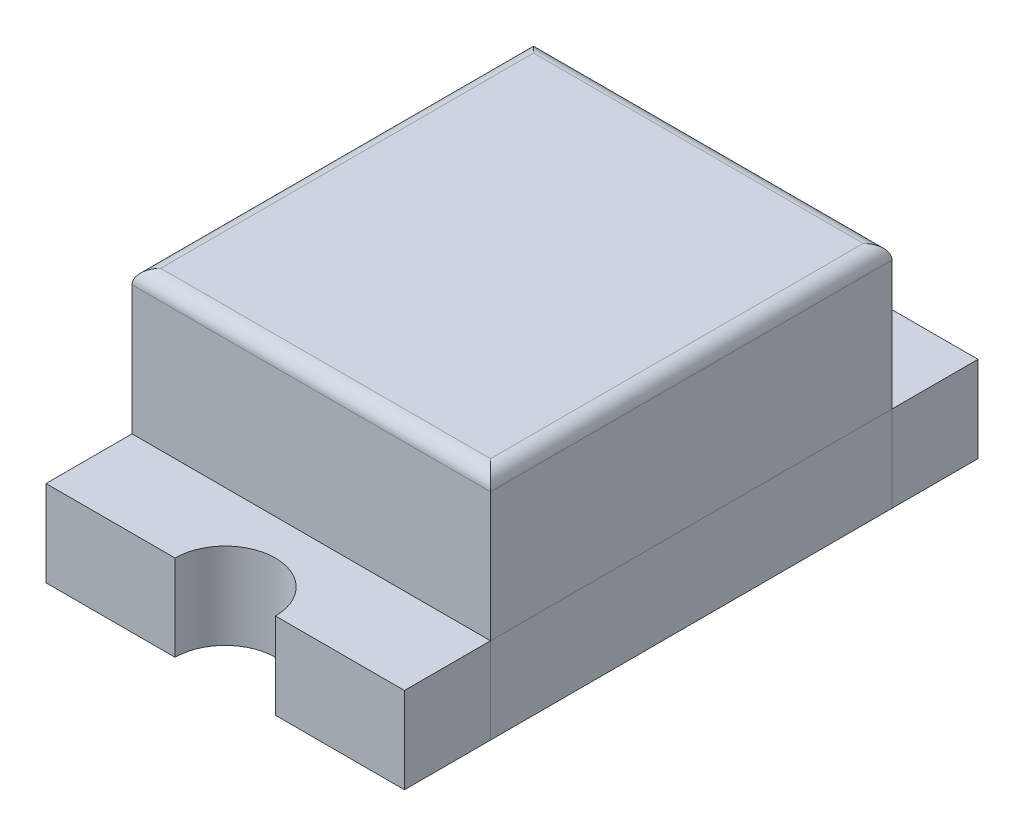
ISO-10303-21;
HEADER;
FILE_DESCRIPTION(('STEP AP214'),'2;1');
FILE_NAME('part.step','',(''),(''),'','','');
FILE_SCHEMA(('AUTOMOTIVE_DESIGN { 1 0 10303 214 1 1 1 1 }'));
ENDSEC;
DATA;
#1=APPLICATION_CONTEXT('core data for automotive mechanical design processes');
#2=APPLICATION_PROTOCOL_DEFINITION('international standard','automotive_design',2000,#1);
#3=PRODUCT_CONTEXT('',#1,'mechanical');
#4=PRODUCT('Part','Part','',(#3));
#5=PRODUCT_RELATED_PRODUCT_CATEGORY('part','',(#4));
#6=PRODUCT_DEFINITION_FORMATION('','',#4);
#7=PRODUCT_DEFINITION_CONTEXT('part definition',#1,'design');
#8=PRODUCT_DEFINITION('design','',#6,#7);
#9=PRODUCT_DEFINITION_SHAPE('','',#8);
#10=(LENGTH_UNIT() NAMED_UNIT(*) SI_UNIT(.MILLI.,.METRE.));
#11=(NAMED_UNIT(*) PLANE_ANGLE_UNIT() SI_UNIT($,.RADIAN.));
#12=(NAMED_UNIT(*) SI_UNIT($,.STERADIAN.) SOLID_ANGLE_UNIT());
#13=UNCERTAINTY_MEASURE_WITH_UNIT(LENGTH_MEASURE(1.E-05),#10,'distance_accuracy_value','');
#14=(GEOMETRIC_REPRESENTATION_CONTEXT(3) GLOBAL_UNCERTAINTY_ASSIGNED_CONTEXT((#13)) GLOBAL_UNIT_ASSIGNED_CONTEXT((#10,
#11,#12)) REPRESENTATION_CONTEXT('',''));
#15=CARTESIAN_POINT('',(0.,0.,0.));
#16=DIRECTION('',(0.,0.,1.));
#17=DIRECTION('',(1.,0.,0.));
#18=AXIS2_PLACEMENT_3D('',#15,#16,#17);
#19=CARTESIAN_POINT('',(0.1,0.35,0.2));
#20=DIRECTION('',(-1.,0.,0.));
#21=DIRECTION('',(0.,0.,1.));
#22=AXIS2_PLACEMENT_3D('',#19,#20,#21);
#23=PLANE('',#22);
#24=DIRECTION('',(0.,0.,-1.));
#25=VECTOR('',#24,1.);
#26=CARTESIAN_POINT('',(0.1,0.3,0.2));
#27=LINE('',#26,#25);
#28=CARTESIAN_POINT('',(0.1,0.3,0.2));
#29=VERTEX_POINT('',#28);
#30=CARTESIAN_POINT('',(0.1,0.3,0.));
#31=VERTEX_POINT('',#30);
#32=EDGE_CURVE('E115',#29,#31,#27,.T.);
#33=ORIENTED_EDGE('',*,*,#32,.T.);
#34=DIRECTION('',(0.,-1.,0.));
#35=VECTOR('',#34,1.);
#36=CARTESIAN_POINT('',(0.1,0.35,0.));
#37=LINE('',#36,#35);
#38=CARTESIAN_POINT('',(0.1,0.35,0.));
#39=VERTEX_POINT('',#38);
#40=EDGE_CURVE('E12',#39,#31,#37,.T.);
#41=ORIENTED_EDGE('',*,*,#40,.F.);
#42=DIRECTION('',(0.,0.,-1.));
#43=VECTOR('',#42,1.);
#44=CARTESIAN_POINT('',(0.1,0.35,0.2));
#45=LINE('',#44,#43);
#46=CARTESIAN_POINT('',(0.1,0.35,0.2));
#47=VERTEX_POINT('',#46);
#48=EDGE_CURVE('E103',#47,#39,#45,.T.);
#49=ORIENTED_EDGE('',*,*,#48,.F.);
#50=DIRECTION('',(0.,-1.,0.));
#51=VECTOR('',#50,1.);
#52=CARTESIAN_POINT('',(0.1,0.35,0.2));
#53=LINE('',#52,#51);
#54=EDGE_CURVE('E111',#47,#29,#53,.T.);
#55=ORIENTED_EDGE('',*,*,#54,.T.);
#56=EDGE_LOOP('',(#33,#41,#49,#55));
#57=FACE_BOUND('',#56,.T.);
#58=ADVANCED_FACE('F52',(#57),#23,.F.);
#59=CARTESIAN_POINT('',(-0.1,0.35,0.));
#60=DIRECTION('',(0.,0.,1.));
#61=DIRECTION('',(1.,0.,0.));
#62=AXIS2_PLACEMENT_3D('',#59,#60,#61);
#63=PLANE('',#62);
#64=DIRECTION('',(-1.,0.,0.));
#65=VECTOR('',#64,1.);
#66=CARTESIAN_POINT('',(-0.1,0.3,0.));
#67=LINE('',#66,#65);
#68=CARTESIAN_POINT('',(-0.1,0.3,0.));
#69=VERTEX_POINT('',#68);
#70=EDGE_CURVE('E107',#31,#69,#67,.T.);
#71=ORIENTED_EDGE('',*,*,#70,.T.);
#72=DIRECTION('',(0.,-1.,0.));
#73=VECTOR('',#72,1.);
#74=CARTESIAN_POINT('',(-0.1,0.35,0.));
#75=LINE('',#74,#73);
#76=CARTESIAN_POINT('',(-0.1,0.35,0.));
#77=VERTEX_POINT('',#76);
#78=EDGE_CURVE('E60',#77,#69,#75,.T.);
#79=ORIENTED_EDGE('',*,*,#78,.F.);
#80=DIRECTION('',(-1.,0.,0.));
#81=VECTOR('',#80,1.);
#82=CARTESIAN_POINT('',(-0.1,0.35,0.));
#83=LINE('',#82,#81);
#84=EDGE_CURVE('E98',#39,#77,#83,.T.);
#85=ORIENTED_EDGE('',*,*,#84,.F.);
#86=ORIENTED_EDGE('',*,*,#40,.T.);
#87=EDGE_LOOP('',(#71,#79,#85,#86));
#88=FACE_BOUND('',#87,.T.);
#89=ADVANCED_FACE('F106',(#88),#63,.F.);
#90=CARTESIAN_POINT('',(-0.1,0.35,0.2));
#91=DIRECTION('',(1.,0.,0.));
#92=DIRECTION('',(0.,0.,-1.));
#93=AXIS2_PLACEMENT_3D('',#90,#91,#92);
#94=PLANE('',#93);
#95=DIRECTION('',(0.,0.,1.));
#96=VECTOR('',#95,1.);
#97=CARTESIAN_POINT('',(-0.1,0.3,0.2));
#98=LINE('',#97,#96);
#99=CARTESIAN_POINT('',(-0.1,0.3,0.2));
#100=VERTEX_POINT('',#99);
#101=EDGE_CURVE('E85',#69,#100,#98,.T.);
#102=ORIENTED_EDGE('',*,*,#101,.T.);
#103=DIRECTION('',(0.,-1.,0.));
#104=VECTOR('',#103,1.);
#105=CARTESIAN_POINT('',(-0.1,0.35,0.2));
#106=LINE('',#105,#104);
#107=CARTESIAN_POINT('',(-0.1,0.35,0.2));
#108=VERTEX_POINT('',#107);
#109=EDGE_CURVE('E108',#108,#100,#106,.T.);
#110=ORIENTED_EDGE('',*,*,#109,.F.);
#111=DIRECTION('',(0.,0.,1.));
#112=VECTOR('',#111,1.);
#113=CARTESIAN_POINT('',(-0.1,0.35,0.2));
#114=LINE('',#113,#112);
#115=EDGE_CURVE('E101',#77,#108,#114,.T.);
#116=ORIENTED_EDGE('',*,*,#115,.F.);
#117=ORIENTED_EDGE('',*,*,#78,.T.);
#118=EDGE_LOOP('',(#102,#110,#116,#117));
#119=FACE_BOUND('',#118,.T.);
#120=ADVANCED_FACE('F109',(#119),#94,.F.);
#121=CARTESIAN_POINT('',(-0.1,0.35,0.2));
#122=DIRECTION('',(0.,0.,-1.));
#123=DIRECTION('',(-1.,0.,0.));
#124=AXIS2_PLACEMENT_3D('',#121,#122,#123);
#125=PLANE('',#124);
#126=DIRECTION('',(1.,0.,0.));
#127=VECTOR('',#126,1.);
#128=CARTESIAN_POINT('',(-0.1,0.3,0.2));
#129=LINE('',#128,#127);
#130=EDGE_CURVE('E91',#100,#29,#129,.T.);
#131=ORIENTED_EDGE('',*,*,#130,.T.);
#132=ORIENTED_EDGE('',*,*,#54,.F.);
#133=DIRECTION('',(1.,0.,0.));
#134=VECTOR('',#133,1.);
#135=CARTESIAN_POINT('',(-0.1,0.35,0.2));
#136=LINE('',#135,#134);
#137=EDGE_CURVE('E68',#108,#47,#136,.T.);
#138=ORIENTED_EDGE('',*,*,#137,.F.);
#139=ORIENTED_EDGE('',*,*,#109,.T.);
#140=EDGE_LOOP('',(#131,#132,#138,#139));
#141=FACE_BOUND('',#140,.T.);
#142=ADVANCED_FACE('F122',(#141),#125,.F.);
#143=CARTESIAN_POINT('',(0.,0.35,0.));
#144=DIRECTION('',(0.,-1.,0.));
#145=DIRECTION('',(0.,0.,-1.));
#146=AXIS2_PLACEMENT_3D('',#143,#144,#145);
#147=PLANE('',#146);
#148=ORIENTED_EDGE('',*,*,#48,.T.);
#149=ORIENTED_EDGE('',*,*,#84,.T.);
#150=ORIENTED_EDGE('',*,*,#115,.T.);
#151=ORIENTED_EDGE('',*,*,#137,.T.);
#152=EDGE_LOOP('',(#148,#149,#150,#151));
#153=FACE_BOUND('',#152,.T.);
#154=ADVANCED_FACE('F99',(#153),#147,.F.);
#155=CARTESIAN_POINT('',(0.,0.3,0.));
#156=DIRECTION('',(0.,-1.,0.));
#157=DIRECTION('',(0.,0.,-1.));
#158=AXIS2_PLACEMENT_3D('',#155,#156,#157);
#159=PLANE('',#158);
#160=ORIENTED_EDGE('',*,*,#32,.F.);
#161=ORIENTED_EDGE('',*,*,#130,.F.);
#162=ORIENTED_EDGE('',*,*,#101,.F.);
#163=ORIENTED_EDGE('',*,*,#70,.F.);
#164=EDGE_LOOP('',(#160,#161,#162,#163));
#165=FACE_BOUND('',#164,.T.);
#166=ADVANCED_FACE('F125',(#165),#159,.T.);
#167=CLOSED_SHELL('',(#58,#89,#120,#142,#154,#166));
#168=MANIFOLD_SOLID_BREP('B2',#167);
#169=CARTESIAN_POINT('',(-0.625,0.8,0.7));
#170=DIRECTION('',(0.,0.,-1.));
#171=DIRECTION('',(-1.,0.,0.));
#172=AXIS2_PLACEMENT_3D('',#169,#170,#171);
#173=PLANE('',#172);
#174=DIRECTION('',(0.,-1.,0.));
#175=VECTOR('',#174,1.);
#176=CARTESIAN_POINT('',(0.625,0.8,0.7));
#177=LINE('',#176,#175);
#178=CARTESIAN_POINT('',(0.625,0.75,0.7));
#179=VERTEX_POINT('',#178);
#180=CARTESIAN_POINT('',(0.625,0.3,0.7));
#181=VERTEX_POINT('',#180);
#182=EDGE_CURVE('E238',#179,#181,#177,.T.);
#183=ORIENTED_EDGE('',*,*,#182,.F.);
#184=DIRECTION('',(1.,0.,0.));
#185=VECTOR('',#184,1.);
#186=CARTESIAN_POINT('',(-0.625,0.75,0.7));
#187=LINE('',#186,#185);
#188=CARTESIAN_POINT('',(-0.625,0.75,0.7));
#189=VERTEX_POINT('',#188);
#190=EDGE_CURVE('E50',#179,#189,#187,.F.);
#191=ORIENTED_EDGE('',*,*,#190,.T.);
#192=DIRECTION('',(0.,-1.,0.));
#193=VECTOR('',#192,1.);
#194=CARTESIAN_POINT('',(-0.625,0.8,0.7));
#195=LINE('',#194,#193);
#196=CARTESIAN_POINT('',(-0.625,0.3,0.7));
#197=VERTEX_POINT('',#196);
#198=EDGE_CURVE('E252',#189,#197,#195,.T.);
#199=ORIENTED_EDGE('',*,*,#198,.T.);
#200=DIRECTION('',(1.,0.,0.));
#201=VECTOR('',#200,1.);
#202=CARTESIAN_POINT('',(-0.625,0.3,0.7));
#203=LINE('',#202,#201);
#204=EDGE_CURVE('E250',#197,#181,#203,.T.);
#205=ORIENTED_EDGE('',*,*,#204,.T.);
#206=EDGE_LOOP('',(#183,#191,#199,#205));
#207=FACE_BOUND('',#206,.T.);
#208=ADVANCED_FACE('F186',(#207),#173,.F.);
#209=CARTESIAN_POINT('',(0.625,0.8,-0.7));
#210=DIRECTION('',(1.,0.,0.));
#211=DIRECTION('',(0.,0.,-1.));
#212=AXIS2_PLACEMENT_3D('',#209,#210,#211);
#213=PLANE('',#212);
#214=DIRECTION('',(0.,-1.,0.));
#215=VECTOR('',#214,1.);
#216=CARTESIAN_POINT('',(0.625,0.8,-0.7));
#217=LINE('',#216,#215);
#218=CARTESIAN_POINT('',(0.625,0.75,-0.7));
#219=VERTEX_POINT('',#218);
#220=CARTESIAN_POINT('',(0.625,0.3,-0.7));
#221=VERTEX_POINT('',#220);
#222=EDGE_CURVE('E247',#219,#221,#217,.T.);
#223=ORIENTED_EDGE('',*,*,#222,.F.);
#224=DIRECTION('',(0.,0.,1.));
#225=VECTOR('',#224,1.);
#226=CARTESIAN_POINT('',(0.625,0.75,0.7));
#227=LINE('',#226,#225);
#228=EDGE_CURVE('E195',#219,#179,#227,.T.);
#229=ORIENTED_EDGE('',*,*,#228,.T.);
#230=ORIENTED_EDGE('',*,*,#182,.T.);
#231=DIRECTION('',(0.,0.,1.));
#232=VECTOR('',#231,1.);
#233=CARTESIAN_POINT('',(0.625,0.3,-0.7));
#234=LINE('',#233,#232);
#235=EDGE_CURVE('E242',#221,#181,#234,.T.);
#236=ORIENTED_EDGE('',*,*,#235,.F.);
#237=EDGE_LOOP('',(#223,#229,#230,#236));
#238=FACE_BOUND('',#237,.T.);
#239=ADVANCED_FACE('F240',(#238),#213,.T.);
#240=CARTESIAN_POINT('',(-0.625,0.8,-0.7));
#241=DIRECTION('',(0.,0.,-1.));
#242=DIRECTION('',(-1.,0.,0.));
#243=AXIS2_PLACEMENT_3D('',#240,#241,#242);
#244=PLANE('',#243);
#245=DIRECTION('',(0.,-1.,0.));
#246=VECTOR('',#245,1.);
#247=CARTESIAN_POINT('',(-0.625,0.8,-0.7));
#248=LINE('',#247,#246);
#249=CARTESIAN_POINT('',(-0.625,0.75,-0.7));
#250=VERTEX_POINT('',#249);
#251=CARTESIAN_POINT('',(-0.625,0.3,-0.7));
#252=VERTEX_POINT('',#251);
#253=EDGE_CURVE('E266',#250,#252,#248,.T.);
#254=ORIENTED_EDGE('',*,*,#253,.F.);
#255=DIRECTION('',(1.,0.,0.));
#256=VECTOR('',#255,1.);
#257=CARTESIAN_POINT('',(0.625,0.75,-0.7));
#258=LINE('',#257,#256);
#259=EDGE_CURVE('E210',#250,#219,#258,.T.);
#260=ORIENTED_EDGE('',*,*,#259,.T.);
#261=ORIENTED_EDGE('',*,*,#222,.T.);
#262=DIRECTION('',(1.,0.,0.));
#263=VECTOR('',#262,1.);
#264=CARTESIAN_POINT('',(-0.625,0.3,-0.7));
#265=LINE('',#264,#263);
#266=EDGE_CURVE('E259',#252,#221,#265,.T.);
#267=ORIENTED_EDGE('',*,*,#266,.F.);
#268=EDGE_LOOP('',(#254,#260,#261,#267));
#269=FACE_BOUND('',#268,.T.);
#270=ADVANCED_FACE('F315',(#269),#244,.T.);
#271=CARTESIAN_POINT('',(-0.625,0.8,-0.7));
#272=DIRECTION('',(1.,0.,0.));
#273=DIRECTION('',(0.,0.,-1.));
#274=AXIS2_PLACEMENT_3D('',#271,#272,#273);
#275=PLANE('',#274);
#276=ORIENTED_EDGE('',*,*,#198,.F.);
#277=DIRECTION('',(0.,0.,1.));
#278=VECTOR('',#277,1.);
#279=CARTESIAN_POINT('',(-0.625,0.75,-0.7));
#280=LINE('',#279,#278);
#281=EDGE_CURVE('E277',#189,#250,#280,.F.);
#282=ORIENTED_EDGE('',*,*,#281,.T.);
#283=ORIENTED_EDGE('',*,*,#253,.T.);
#284=DIRECTION('',(0.,0.,1.));
#285=VECTOR('',#284,1.);
#286=CARTESIAN_POINT('',(-0.625,0.3,-0.7));
#287=LINE('',#286,#285);
#288=EDGE_CURVE('E261',#252,#197,#287,.T.);
#289=ORIENTED_EDGE('',*,*,#288,.T.);
#290=EDGE_LOOP('',(#276,#282,#283,#289));
#291=FACE_BOUND('',#290,.T.);
#292=ADVANCED_FACE('F302',(#291),#275,.F.);
#293=CARTESIAN_POINT('',(0.,0.8,0.));
#294=DIRECTION('',(0.,-1.,0.));
#295=DIRECTION('',(0.,0.,-1.));
#296=AXIS2_PLACEMENT_3D('',#293,#294,#295);
#297=PLANE('',#296);
#298=DIRECTION('',(1.,0.,0.));
#299=VECTOR('',#298,1.);
#300=CARTESIAN_POINT('',(-0.625,0.8,-0.65));
#301=LINE('',#300,#299);
#302=CARTESIAN_POINT('',(0.575,0.8,-0.65));
#303=VERTEX_POINT('',#302);
#304=CARTESIAN_POINT('',(-0.575,0.8,-0.65));
#305=VERTEX_POINT('',#304);
#306=EDGE_CURVE('E272',#303,#305,#301,.F.);
#307=ORIENTED_EDGE('',*,*,#306,.T.);
#308=DIRECTION('',(0.,0.,1.));
#309=VECTOR('',#308,1.);
#310=CARTESIAN_POINT('',(-0.575,0.8,0.));
#311=LINE('',#310,#309);
#312=CARTESIAN_POINT('',(-0.575,0.8,0.65));
#313=VERTEX_POINT('',#312);
#314=EDGE_CURVE('E274',#305,#313,#311,.T.);
#315=ORIENTED_EDGE('',*,*,#314,.T.);
#316=DIRECTION('',(1.,0.,0.));
#317=VECTOR('',#316,1.);
#318=CARTESIAN_POINT('',(0.,0.8,0.65));
#319=LINE('',#318,#317);
#320=CARTESIAN_POINT('',(0.575,0.8,0.65));
#321=VERTEX_POINT('',#320);
#322=EDGE_CURVE('E246',#313,#321,#319,.T.);
#323=ORIENTED_EDGE('',*,*,#322,.T.);
#324=DIRECTION('',(0.,0.,1.));
#325=VECTOR('',#324,1.);
#326=CARTESIAN_POINT('',(0.575,0.8,-0.7));
#327=LINE('',#326,#325);
#328=EDGE_CURVE('E270',#321,#303,#327,.F.);
#329=ORIENTED_EDGE('',*,*,#328,.T.);
#330=EDGE_LOOP('',(#307,#315,#323,#329));
#331=FACE_BOUND('',#330,.T.);
#332=ADVANCED_FACE('F307',(#331),#297,.F.);
#333=CARTESIAN_POINT('',(0.,0.3,0.));
#334=DIRECTION('',(0.,-1.,0.));
#335=DIRECTION('',(0.,0.,-1.));
#336=AXIS2_PLACEMENT_3D('',#333,#334,#335);
#337=PLANE('',#336);
#338=ORIENTED_EDGE('',*,*,#204,.F.);
#339=ORIENTED_EDGE('',*,*,#288,.F.);
#340=ORIENTED_EDGE('',*,*,#266,.T.);
#341=ORIENTED_EDGE('',*,*,#235,.T.);
#342=EDGE_LOOP('',(#338,#339,#340,#341));
#343=FACE_BOUND('',#342,.T.);
#344=ADVANCED_FACE('F257',(#343),#337,.T.);
#345=CARTESIAN_POINT('',(0.575,0.75,-0.7));
#346=DIRECTION('',(0.,0.,-1.));
#347=DIRECTION('',(-1.,0.,0.));
#348=AXIS2_PLACEMENT_3D('',#345,#346,#347);
#349=CYLINDRICAL_SURFACE('',#348,0.05);
#350=CARTESIAN_POINT('',(0.575,0.75,0.65));
#351=DIRECTION('',(0.707106781186547,0.,-0.707106781186547));
#352=DIRECTION('',(0.707106781186547,0.,0.707106781186547));
#353=AXIS2_PLACEMENT_3D('',#350,#351,#352);
#354=ELLIPSE('',#353,0.0707106781186548,0.05);
#355=EDGE_CURVE('E285',#179,#321,#354,.F.);
#356=ORIENTED_EDGE('',*,*,#355,.F.);
#357=ORIENTED_EDGE('',*,*,#228,.F.);
#358=CARTESIAN_POINT('',(0.575,0.75,-0.65));
#359=DIRECTION('',(-0.707106781186547,0.,-0.707106781186547));
#360=DIRECTION('',(0.707106781186547,0.,-0.707106781186547));
#361=AXIS2_PLACEMENT_3D('',#358,#359,#360);
#362=ELLIPSE('',#361,0.0707106781186548,0.05);
#363=EDGE_CURVE('E190',#303,#219,#362,.T.);
#364=ORIENTED_EDGE('',*,*,#363,.F.);
#365=ORIENTED_EDGE('',*,*,#328,.F.);
#366=EDGE_LOOP('',(#356,#357,#364,#365));
#367=FACE_BOUND('',#366,.T.);
#368=ADVANCED_FACE('F188',(#367),#349,.T.);
#369=CARTESIAN_POINT('',(-0.625,0.75,-0.65));
#370=DIRECTION('',(-1.,0.,0.));
#371=DIRECTION('',(0.,0.,1.));
#372=AXIS2_PLACEMENT_3D('',#369,#370,#371);
#373=CYLINDRICAL_SURFACE('',#372,0.05);
#374=ORIENTED_EDGE('',*,*,#363,.T.);
#375=ORIENTED_EDGE('',*,*,#259,.F.);
#376=CARTESIAN_POINT('',(-0.575,0.75,-0.65));
#377=DIRECTION('',(-0.707106781186547,0.,0.707106781186547));
#378=DIRECTION('',(-0.707106781186547,0.,-0.707106781186547));
#379=AXIS2_PLACEMENT_3D('',#376,#377,#378);
#380=ELLIPSE('',#379,0.0707106781186548,0.05);
#381=EDGE_CURVE('E284',#305,#250,#380,.T.);
#382=ORIENTED_EDGE('',*,*,#381,.F.);
#383=ORIENTED_EDGE('',*,*,#306,.F.);
#384=EDGE_LOOP('',(#374,#375,#382,#383));
#385=FACE_BOUND('',#384,.T.);
#386=ADVANCED_FACE('F294',(#385),#373,.T.);
#387=CARTESIAN_POINT('',(0.,0.75,0.65));
#388=DIRECTION('',(1.,0.,0.));
#389=DIRECTION('',(0.,0.,-1.));
#390=AXIS2_PLACEMENT_3D('',#387,#388,#389);
#391=CYLINDRICAL_SURFACE('',#390,0.05);
#392=ORIENTED_EDGE('',*,*,#355,.T.);
#393=ORIENTED_EDGE('',*,*,#322,.F.);
#394=CARTESIAN_POINT('',(-0.575,0.75,0.65));
#395=DIRECTION('',(0.707106781186547,0.,0.707106781186547));
#396=DIRECTION('',(0.707106781186547,0.,-0.707106781186547));
#397=AXIS2_PLACEMENT_3D('',#394,#395,#396);
#398=ELLIPSE('',#397,0.0707106781186548,0.05);
#399=EDGE_CURVE('E282',#189,#313,#398,.F.);
#400=ORIENTED_EDGE('',*,*,#399,.F.);
#401=ORIENTED_EDGE('',*,*,#190,.F.);
#402=EDGE_LOOP('',(#392,#393,#400,#401));
#403=FACE_BOUND('',#402,.T.);
#404=ADVANCED_FACE('F299',(#403),#391,.T.);
#405=CARTESIAN_POINT('',(-0.575,0.75,0.));
#406=DIRECTION('',(0.,0.,1.));
#407=DIRECTION('',(1.,0.,0.));
#408=AXIS2_PLACEMENT_3D('',#405,#406,#407);
#409=CYLINDRICAL_SURFACE('',#408,0.05);
#410=ORIENTED_EDGE('',*,*,#381,.T.);
#411=ORIENTED_EDGE('',*,*,#281,.F.);
#412=ORIENTED_EDGE('',*,*,#399,.T.);
#413=ORIENTED_EDGE('',*,*,#314,.F.);
#414=EDGE_LOOP('',(#410,#411,#412,#413));
#415=FACE_BOUND('',#414,.T.);
#416=ADVANCED_FACE('F304',(#415),#409,.T.);
#417=CLOSED_SHELL('',(#208,#239,#270,#292,#332,#344,#368,#386,#404,#416));
#418=MANIFOLD_SOLID_BREP('B6',#417);
#419=CARTESIAN_POINT('',(-0.625,0.3,0.));
#420=DIRECTION('',(1.,0.,0.));
#421=DIRECTION('',(0.,0.,-1.));
#422=AXIS2_PLACEMENT_3D('',#419,#420,#421);
#423=PLANE('',#422);
#424=DIRECTION('',(0.,0.,1.));
#425=VECTOR('',#424,1.);
#426=CARTESIAN_POINT('',(-0.625,0.,0.));
#427=LINE('',#426,#425);
#428=CARTESIAN_POINT('',(-0.625,0.,-0.7));
#429=VERTEX_POINT('',#428);
#430=CARTESIAN_POINT('',(-0.625,0.,0.7));
#431=VERTEX_POINT('',#430);
#432=EDGE_CURVE('E463',#429,#431,#427,.T.);
#433=ORIENTED_EDGE('',*,*,#432,.T.);
#434=DIRECTION('',(0.,-1.,0.));
#435=VECTOR('',#434,1.);
#436=CARTESIAN_POINT('',(-0.625,0.3,0.7));
#437=LINE('',#436,#435);
#438=CARTESIAN_POINT('',(-0.625,0.3,0.7));
#439=VERTEX_POINT('',#438);
#440=EDGE_CURVE('E184',#439,#431,#437,.T.);
#441=ORIENTED_EDGE('',*,*,#440,.F.);
#442=DIRECTION('',(0.,0.,1.));
#443=VECTOR('',#442,1.);
#444=CARTESIAN_POINT('',(-0.625,0.3,0.));
#445=LINE('',#444,#443);
#446=CARTESIAN_POINT('',(-0.625,0.3,-0.7));
#447=VERTEX_POINT('',#446);
#448=EDGE_CURVE('E449',#447,#439,#445,.T.);
#449=ORIENTED_EDGE('',*,*,#448,.F.);
#450=DIRECTION('',(0.,-1.,0.));
#451=VECTOR('',#450,1.);
#452=CARTESIAN_POINT('',(-0.625,0.3,-0.7));
#453=LINE('',#452,#451);
#454=EDGE_CURVE('E416',#447,#429,#453,.T.);
#455=ORIENTED_EDGE('',*,*,#454,.T.);
#456=EDGE_LOOP('',(#433,#441,#449,#455));
#457=FACE_BOUND('',#456,.T.);
#458=ADVANCED_FACE('F400',(#457),#423,.F.);
#459=CARTESIAN_POINT('',(0.,0.3,0.7));
#460=DIRECTION('',(0.,0.,-1.));
#461=DIRECTION('',(-1.,0.,0.));
#462=AXIS2_PLACEMENT_3D('',#459,#460,#461);
#463=PLANE('',#462);
#464=DIRECTION('',(1.,0.,0.));
#465=VECTOR('',#464,1.);
#466=CARTESIAN_POINT('',(0.,0.,0.7));
#467=LINE('',#466,#465);
#468=CARTESIAN_POINT('',(0.625,0.,0.7));
#469=VERTEX_POINT('',#468);
#470=EDGE_CURVE('E454',#431,#469,#467,.T.);
#471=ORIENTED_EDGE('',*,*,#470,.T.);
#472=DIRECTION('',(0.,-1.,0.));
#473=VECTOR('',#472,1.);
#474=CARTESIAN_POINT('',(0.625,0.3,0.7));
#475=LINE('',#474,#473);
#476=CARTESIAN_POINT('',(0.625,0.3,0.7));
#477=VERTEX_POINT('',#476);
#478=EDGE_CURVE('E408',#477,#469,#475,.T.);
#479=ORIENTED_EDGE('',*,*,#478,.F.);
#480=DIRECTION('',(1.,0.,0.));
#481=VECTOR('',#480,1.);
#482=CARTESIAN_POINT('',(0.,0.3,0.7));
#483=LINE('',#482,#481);
#484=EDGE_CURVE('E441',#439,#477,#483,.T.);
#485=ORIENTED_EDGE('',*,*,#484,.F.);
#486=ORIENTED_EDGE('',*,*,#440,.T.);
#487=EDGE_LOOP('',(#471,#479,#485,#486));
#488=FACE_BOUND('',#487,.T.);
#489=ADVANCED_FACE('F453',(#488),#463,.F.);
#490=CARTESIAN_POINT('',(0.625,0.3,0.));
#491=DIRECTION('',(1.,0.,0.));
#492=DIRECTION('',(0.,0.,-1.));
#493=AXIS2_PLACEMENT_3D('',#490,#491,#492);
#494=PLANE('',#493);
#495=DIRECTION('',(0.,0.,1.));
#496=VECTOR('',#495,1.);
#497=CARTESIAN_POINT('',(0.625,0.,0.));
#498=LINE('',#497,#496);
#499=CARTESIAN_POINT('',(0.625,0.,-0.7));
#500=VERTEX_POINT('',#499);
#501=EDGE_CURVE('E466',#500,#469,#498,.T.);
#502=ORIENTED_EDGE('',*,*,#501,.F.);
#503=DIRECTION('',(0.,-1.,0.));
#504=VECTOR('',#503,1.);
#505=CARTESIAN_POINT('',(0.625,0.3,-0.7));
#506=LINE('',#505,#504);
#507=CARTESIAN_POINT('',(0.625,0.3,-0.7));
#508=VERTEX_POINT('',#507);
#509=EDGE_CURVE('E430',#508,#500,#506,.T.);
#510=ORIENTED_EDGE('',*,*,#509,.F.);
#511=DIRECTION('',(0.,0.,1.));
#512=VECTOR('',#511,1.);
#513=CARTESIAN_POINT('',(0.625,0.3,0.));
#514=LINE('',#513,#512);
#515=EDGE_CURVE('E448',#508,#477,#514,.T.);
#516=ORIENTED_EDGE('',*,*,#515,.T.);
#517=ORIENTED_EDGE('',*,*,#478,.T.);
#518=EDGE_LOOP('',(#502,#510,#516,#517));
#519=FACE_BOUND('',#518,.T.);
#520=ADVANCED_FACE('F457',(#519),#494,.T.);
#521=CARTESIAN_POINT('',(0.,0.3,-0.7));
#522=DIRECTION('',(0.,0.,-1.));
#523=DIRECTION('',(-1.,0.,0.));
#524=AXIS2_PLACEMENT_3D('',#521,#522,#523);
#525=PLANE('',#524);
#526=DIRECTION('',(1.,0.,0.));
#527=VECTOR('',#526,1.);
#528=CARTESIAN_POINT('',(0.,0.,-0.7));
#529=LINE('',#528,#527);
#530=EDGE_CURVE('E468',#429,#500,#529,.T.);
#531=ORIENTED_EDGE('',*,*,#530,.F.);
#532=ORIENTED_EDGE('',*,*,#454,.F.);
#533=DIRECTION('',(1.,0.,0.));
#534=VECTOR('',#533,1.);
#535=CARTESIAN_POINT('',(0.,0.3,-0.7));
#536=LINE('',#535,#534);
#537=EDGE_CURVE('E458',#447,#508,#536,.T.);
#538=ORIENTED_EDGE('',*,*,#537,.T.);
#539=ORIENTED_EDGE('',*,*,#509,.T.);
#540=EDGE_LOOP('',(#531,#532,#538,#539));
#541=FACE_BOUND('',#540,.T.);
#542=ADVANCED_FACE('F474',(#541),#525,.T.);
#543=CARTESIAN_POINT('',(0.,0.3,0.));
#544=DIRECTION('',(0.,1.,0.));
#545=DIRECTION('',(0.,0.,1.));
#546=AXIS2_PLACEMENT_3D('',#543,#544,#545);
#547=PLANE('',#546);
#548=ORIENTED_EDGE('',*,*,#448,.T.);
#549=ORIENTED_EDGE('',*,*,#484,.T.);
#550=ORIENTED_EDGE('',*,*,#515,.F.);
#551=ORIENTED_EDGE('',*,*,#537,.F.);
#552=EDGE_LOOP('',(#548,#549,#550,#551));
#553=FACE_BOUND('',#552,.T.);
#554=ADVANCED_FACE('F445',(#553),#547,.T.);
#555=CARTESIAN_POINT('',(0.,0.,0.));
#556=DIRECTION('',(0.,1.,0.));
#557=DIRECTION('',(0.,0.,1.));
#558=AXIS2_PLACEMENT_3D('',#555,#556,#557);
#559=PLANE('',#558);
#560=ORIENTED_EDGE('',*,*,#432,.F.);
#561=ORIENTED_EDGE('',*,*,#530,.T.);
#562=ORIENTED_EDGE('',*,*,#501,.T.);
#563=ORIENTED_EDGE('',*,*,#470,.F.);
#564=EDGE_LOOP('',(#560,#561,#562,#563));
#565=FACE_BOUND('',#564,.T.);
#566=ADVANCED_FACE('F473',(#565),#559,.F.);
#567=CLOSED_SHELL('',(#458,#489,#520,#542,#554,#566));
#568=MANIFOLD_SOLID_BREP('B44',#567);
#569=CARTESIAN_POINT('',(0.,0.3,1.));
#570=DIRECTION('',(0.,-1.,0.));
#571=DIRECTION('',(0.,0.,-1.));
#572=AXIS2_PLACEMENT_3D('',#569,#570,#571);
#573=CYLINDRICAL_SURFACE('',#572,0.175);
#574=CARTESIAN_POINT('',(0.,0.,1.));
#575=DIRECTION('',(0.,1.,0.));
#576=DIRECTION('',(0.,0.,1.));
#577=AXIS2_PLACEMENT_3D('',#574,#575,#576);
#578=CIRCLE('',#577,0.175);
#579=CARTESIAN_POINT('',(0.175,0.,1.));
#580=VERTEX_POINT('',#579);
#581=CARTESIAN_POINT('',(-0.175,0.,1.));
#582=VERTEX_POINT('',#581);
#583=EDGE_CURVE('E615',#580,#582,#578,.T.);
#584=ORIENTED_EDGE('',*,*,#583,.F.);
#585=DIRECTION('',(0.,-1.,0.));
#586=VECTOR('',#585,1.);
#587=CARTESIAN_POINT('',(0.175,0.3,1.));
#588=LINE('',#587,#586);
#589=CARTESIAN_POINT('',(0.175,0.3,1.));
#590=VERTEX_POINT('',#589);
#591=EDGE_CURVE('E398',#590,#580,#588,.T.);
#592=ORIENTED_EDGE('',*,*,#591,.F.);
#593=CARTESIAN_POINT('',(0.,0.3,1.));
#594=DIRECTION('',(0.,1.,0.));
#595=DIRECTION('',(0.,0.,1.));
#596=AXIS2_PLACEMENT_3D('',#593,#594,#595);
#597=CIRCLE('',#596,0.175);
#598=CARTESIAN_POINT('',(-0.175,0.3,1.));
#599=VERTEX_POINT('',#598);
#600=EDGE_CURVE('E639',#590,#599,#597,.T.);
#601=ORIENTED_EDGE('',*,*,#600,.T.);
#602=DIRECTION('',(0.,-1.,0.));
#603=VECTOR('',#602,1.);
#604=CARTESIAN_POINT('',(-0.175,0.3,1.));
#605=LINE('',#604,#603);
#606=EDGE_CURVE('E549',#599,#582,#605,.T.);
#607=ORIENTED_EDGE('',*,*,#606,.T.);
#608=EDGE_LOOP('',(#584,#592,#601,#607));
#609=FACE_BOUND('',#608,.T.);
#610=ADVANCED_FACE('F533',(#609),#573,.F.);
#611=CARTESIAN_POINT('',(0.,0.3,1.));
#612=DIRECTION('',(0.,0.,1.));
#613=DIRECTION('',(1.,0.,0.));
#614=AXIS2_PLACEMENT_3D('',#611,#612,#613);
#615=PLANE('',#614);
#616=DIRECTION('',(-1.,0.,0.));
#617=VECTOR('',#616,1.);
#618=CARTESIAN_POINT('',(0.,0.,1.));
#619=LINE('',#618,#617);
#620=CARTESIAN_POINT('',(0.625,0.,1.));
#621=VERTEX_POINT('',#620);
#622=EDGE_CURVE('E617',#621,#580,#619,.T.);
#623=ORIENTED_EDGE('',*,*,#622,.F.);
#624=DIRECTION('',(0.,-1.,0.));
#625=VECTOR('',#624,1.);
#626=CARTESIAN_POINT('',(0.625,0.3,1.));
#627=LINE('',#626,#625);
#628=CARTESIAN_POINT('',(0.625,0.3,1.));
#629=VERTEX_POINT('',#628);
#630=EDGE_CURVE('E541',#629,#621,#627,.T.);
#631=ORIENTED_EDGE('',*,*,#630,.F.);
#632=DIRECTION('',(-1.,0.,0.));
#633=VECTOR('',#632,1.);
#634=CARTESIAN_POINT('',(0.,0.3,1.));
#635=LINE('',#634,#633);
#636=EDGE_CURVE('E611',#629,#590,#635,.T.);
#637=ORIENTED_EDGE('',*,*,#636,.T.);
#638=ORIENTED_EDGE('',*,*,#591,.T.);
#639=EDGE_LOOP('',(#623,#631,#637,#638));
#640=FACE_BOUND('',#639,.T.);
#641=ADVANCED_FACE('F635',(#640),#615,.T.);
#642=CARTESIAN_POINT('',(0.625,0.3,0.));
#643=DIRECTION('',(1.,0.,0.));
#644=DIRECTION('',(0.,0.,-1.));
#645=AXIS2_PLACEMENT_3D('',#642,#643,#644);
#646=PLANE('',#645);
#647=DIRECTION('',(0.,0.,1.));
#648=VECTOR('',#647,1.);
#649=CARTESIAN_POINT('',(0.625,0.,0.));
#650=LINE('',#649,#648);
#651=CARTESIAN_POINT('',(0.625,0.,0.7));
#652=VERTEX_POINT('',#651);
#653=EDGE_CURVE('E620',#652,#621,#650,.T.);
#654=ORIENTED_EDGE('',*,*,#653,.F.);
#655=DIRECTION('',(0.,-1.,0.));
#656=VECTOR('',#655,1.);
#657=CARTESIAN_POINT('',(0.625,0.3,0.7));
#658=LINE('',#657,#656);
#659=CARTESIAN_POINT('',(0.625,0.3,0.7));
#660=VERTEX_POINT('',#659);
#661=EDGE_CURVE('E597',#660,#652,#658,.T.);
#662=ORIENTED_EDGE('',*,*,#661,.F.);
#663=DIRECTION('',(0.,0.,1.));
#664=VECTOR('',#663,1.);
#665=CARTESIAN_POINT('',(0.625,0.3,0.));
#666=LINE('',#665,#664);
#667=EDGE_CURVE('E609',#660,#629,#666,.T.);
#668=ORIENTED_EDGE('',*,*,#667,.T.);
#669=ORIENTED_EDGE('',*,*,#630,.T.);
#670=EDGE_LOOP('',(#654,#662,#668,#669));
#671=FACE_BOUND('',#670,.T.);
#672=ADVANCED_FACE('F632',(#671),#646,.T.);
#673=CARTESIAN_POINT('',(0.,0.3,0.7));
#674=DIRECTION('',(0.,0.,-1.));
#675=DIRECTION('',(-1.,0.,0.));
#676=AXIS2_PLACEMENT_3D('',#673,#674,#675);
#677=PLANE('',#676);
#678=DIRECTION('',(1.,0.,0.));
#679=VECTOR('',#678,1.);
#680=CARTESIAN_POINT('',(0.,0.,0.7));
#681=LINE('',#680,#679);
#682=CARTESIAN_POINT('',(-0.625,0.,0.7));
#683=VERTEX_POINT('',#682);
#684=EDGE_CURVE('E594',#683,#652,#681,.T.);
#685=ORIENTED_EDGE('',*,*,#684,.F.);
#686=DIRECTION('',(0.,-1.,0.));
#687=VECTOR('',#686,1.);
#688=CARTESIAN_POINT('',(-0.625,0.3,0.7));
#689=LINE('',#688,#687);
#690=CARTESIAN_POINT('',(-0.625,0.3,0.7));
#691=VERTEX_POINT('',#690);
#692=EDGE_CURVE('E588',#691,#683,#689,.T.);
#693=ORIENTED_EDGE('',*,*,#692,.F.);
#694=DIRECTION('',(1.,0.,0.));
#695=VECTOR('',#694,1.);
#696=CARTESIAN_POINT('',(0.,0.3,0.7));
#697=LINE('',#696,#695);
#698=EDGE_CURVE('E592',#691,#660,#697,.T.);
#699=ORIENTED_EDGE('',*,*,#698,.T.);
#700=ORIENTED_EDGE('',*,*,#661,.T.);
#701=EDGE_LOOP('',(#685,#693,#699,#700));
#702=FACE_BOUND('',#701,.T.);
#703=ADVANCED_FACE('F590',(#702),#677,.T.);
#704=CARTESIAN_POINT('',(-0.625,0.3,0.));
#705=DIRECTION('',(1.,0.,0.));
#706=DIRECTION('',(0.,0.,-1.));
#707=AXIS2_PLACEMENT_3D('',#704,#705,#706);
#708=PLANE('',#707);
#709=DIRECTION('',(0.,0.,1.));
#710=VECTOR('',#709,1.);
#711=CARTESIAN_POINT('',(-0.625,0.,0.));
#712=LINE('',#711,#710);
#713=CARTESIAN_POINT('',(-0.625,0.,1.));
#714=VERTEX_POINT('',#713);
#715=EDGE_CURVE('E625',#683,#714,#712,.T.);
#716=ORIENTED_EDGE('',*,*,#715,.T.);
#717=DIRECTION('',(0.,-1.,0.));
#718=VECTOR('',#717,1.);
#719=CARTESIAN_POINT('',(-0.625,0.3,1.));
#720=LINE('',#719,#718);
#721=CARTESIAN_POINT('',(-0.625,0.3,1.));
#722=VERTEX_POINT('',#721);
#723=EDGE_CURVE('E569',#722,#714,#720,.T.);
#724=ORIENTED_EDGE('',*,*,#723,.F.);
#725=DIRECTION('',(0.,0.,1.));
#726=VECTOR('',#725,1.);
#727=CARTESIAN_POINT('',(-0.625,0.3,0.));
#728=LINE('',#727,#726);
#729=EDGE_CURVE('E599',#691,#722,#728,.T.);
#730=ORIENTED_EDGE('',*,*,#729,.F.);
#731=ORIENTED_EDGE('',*,*,#692,.T.);
#732=EDGE_LOOP('',(#716,#724,#730,#731));
#733=FACE_BOUND('',#732,.T.);
#734=ADVANCED_FACE('F600',(#733),#708,.F.);
#735=EDGE_CURVE('E621',#582,#714,#619,.T.);
#736=ORIENTED_EDGE('',*,*,#735,.F.);
#737=ORIENTED_EDGE('',*,*,#606,.F.);
#738=EDGE_CURVE('E603',#599,#722,#635,.T.);
#739=ORIENTED_EDGE('',*,*,#738,.T.);
#740=ORIENTED_EDGE('',*,*,#723,.T.);
#741=EDGE_LOOP('',(#736,#737,#739,#740));
#742=FACE_BOUND('',#741,.T.);
#743=ADVANCED_FACE('F641',(#742),#615,.T.);
#744=CARTESIAN_POINT('',(0.,0.3,0.));
#745=DIRECTION('',(0.,1.,0.));
#746=DIRECTION('',(0.,0.,1.));
#747=AXIS2_PLACEMENT_3D('',#744,#745,#746);
#748=PLANE('',#747);
#749=ORIENTED_EDGE('',*,*,#600,.F.);
#750=ORIENTED_EDGE('',*,*,#636,.F.);
#751=ORIENTED_EDGE('',*,*,#667,.F.);
#752=ORIENTED_EDGE('',*,*,#698,.F.);
#753=ORIENTED_EDGE('',*,*,#729,.T.);
#754=ORIENTED_EDGE('',*,*,#738,.F.);
#755=EDGE_LOOP('',(#749,#750,#751,#752,#753,#754));
#756=FACE_BOUND('',#755,.T.);
#757=ADVANCED_FACE('F606',(#756),#748,.T.);
#758=CARTESIAN_POINT('',(0.,0.,0.));
#759=DIRECTION('',(0.,1.,0.));
#760=DIRECTION('',(0.,0.,1.));
#761=AXIS2_PLACEMENT_3D('',#758,#759,#760);
#762=PLANE('',#761);
#763=ORIENTED_EDGE('',*,*,#583,.T.);
#764=ORIENTED_EDGE('',*,*,#735,.T.);
#765=ORIENTED_EDGE('',*,*,#715,.F.);
#766=ORIENTED_EDGE('',*,*,#684,.T.);
#767=ORIENTED_EDGE('',*,*,#653,.T.);
#768=ORIENTED_EDGE('',*,*,#622,.T.);
#769=EDGE_LOOP('',(#763,#764,#765,#766,#767,#768));
#770=FACE_BOUND('',#769,.T.);
#771=ADVANCED_FACE('F637',(#770),#762,.F.);
#772=CLOSED_SHELL('',(#610,#641,#672,#703,#734,#743,#757,#771));
#773=MANIFOLD_SOLID_BREP('B178',#772);
#774=CARTESIAN_POINT('',(0.,0.3,-1.));
#775=DIRECTION('',(0.,-1.,0.));
#776=DIRECTION('',(0.,0.,-1.));
#777=AXIS2_PLACEMENT_3D('',#774,#775,#776);
#778=CYLINDRICAL_SURFACE('',#777,0.175);
#779=CARTESIAN_POINT('',(0.,0.,-1.));
#780=DIRECTION('',(0.,1.,0.));
#781=DIRECTION('',(0.,0.,1.));
#782=AXIS2_PLACEMENT_3D('',#779,#780,#781);
#783=CIRCLE('',#782,0.175);
#784=CARTESIAN_POINT('',(-0.175,0.,-1.));
#785=VERTEX_POINT('',#784);
#786=CARTESIAN_POINT('',(0.175,0.,-1.));
#787=VERTEX_POINT('',#786);
#788=EDGE_CURVE('E789',#785,#787,#783,.T.);
#789=ORIENTED_EDGE('',*,*,#788,.F.);
#790=DIRECTION('',(0.,-1.,0.));
#791=VECTOR('',#790,1.);
#792=CARTESIAN_POINT('',(-0.175,0.3,-1.));
#793=LINE('',#792,#791);
#794=CARTESIAN_POINT('',(-0.175,0.3,-1.));
#795=VERTEX_POINT('',#794);
#796=EDGE_CURVE('E531',#795,#785,#793,.T.);
#797=ORIENTED_EDGE('',*,*,#796,.F.);
#798=CARTESIAN_POINT('',(0.,0.3,-1.));
#799=DIRECTION('',(0.,1.,0.));
#800=DIRECTION('',(0.,0.,1.));
#801=AXIS2_PLACEMENT_3D('',#798,#799,#800);
#802=CIRCLE('',#801,0.175);
#803=CARTESIAN_POINT('',(0.175,0.3,-1.));
#804=VERTEX_POINT('',#803);
#805=EDGE_CURVE('E811',#795,#804,#802,.T.);
#806=ORIENTED_EDGE('',*,*,#805,.T.);
#807=DIRECTION('',(0.,-1.,0.));
#808=VECTOR('',#807,1.);
#809=CARTESIAN_POINT('',(0.175,0.3,-1.));
#810=LINE('',#809,#808);
#811=EDGE_CURVE('E750',#804,#787,#810,.T.);
#812=ORIENTED_EDGE('',*,*,#811,.T.);
#813=EDGE_LOOP('',(#789,#797,#806,#812));
#814=FACE_BOUND('',#813,.T.);
#815=ADVANCED_FACE('F706',(#814),#778,.F.);
#816=CARTESIAN_POINT('',(0.,0.3,-1.));
#817=DIRECTION('',(0.,0.,1.));
#818=DIRECTION('',(1.,0.,0.));
#819=AXIS2_PLACEMENT_3D('',#816,#817,#818);
#820=PLANE('',#819);
#821=DIRECTION('',(-1.,0.,0.));
#822=VECTOR('',#821,1.);
#823=CARTESIAN_POINT('',(0.,0.,-1.));
#824=LINE('',#823,#822);
#825=CARTESIAN_POINT('',(-0.625,0.,-1.));
#826=VERTEX_POINT('',#825);
#827=EDGE_CURVE('E792',#785,#826,#824,.T.);
#828=ORIENTED_EDGE('',*,*,#827,.T.);
#829=DIRECTION('',(0.,-1.,0.));
#830=VECTOR('',#829,1.);
#831=CARTESIAN_POINT('',(-0.625,0.3,-1.));
#832=LINE('',#831,#830);
#833=CARTESIAN_POINT('',(-0.625,0.3,-1.));
#834=VERTEX_POINT('',#833);
#835=EDGE_CURVE('E714',#834,#826,#832,.T.);
#836=ORIENTED_EDGE('',*,*,#835,.F.);
#837=DIRECTION('',(-1.,0.,0.));
#838=VECTOR('',#837,1.);
#839=CARTESIAN_POINT('',(0.,0.3,-1.));
#840=LINE('',#839,#838);
#841=EDGE_CURVE('E786',#795,#834,#840,.T.);
#842=ORIENTED_EDGE('',*,*,#841,.F.);
#843=ORIENTED_EDGE('',*,*,#796,.T.);
#844=EDGE_LOOP('',(#828,#836,#842,#843));
#845=FACE_BOUND('',#844,.T.);
#846=ADVANCED_FACE('F813',(#845),#820,.F.);
#847=CARTESIAN_POINT('',(-0.625,0.3,0.));
#848=DIRECTION('',(1.,0.,0.));
#849=DIRECTION('',(0.,0.,-1.));
#850=AXIS2_PLACEMENT_3D('',#847,#848,#849);
#851=PLANE('',#850);
#852=DIRECTION('',(0.,0.,1.));
#853=VECTOR('',#852,1.);
#854=CARTESIAN_POINT('',(-0.625,0.,0.));
#855=LINE('',#854,#853);
#856=CARTESIAN_POINT('',(-0.625,0.,-0.7));
#857=VERTEX_POINT('',#856);
#858=EDGE_CURVE('E794',#826,#857,#855,.T.);
#859=ORIENTED_EDGE('',*,*,#858,.T.);
#860=DIRECTION('',(0.,-1.,0.));
#861=VECTOR('',#860,1.);
#862=CARTESIAN_POINT('',(-0.625,0.3,-0.7));
#863=LINE('',#862,#861);
#864=CARTESIAN_POINT('',(-0.625,0.3,-0.7));
#865=VERTEX_POINT('',#864);
#866=EDGE_CURVE('E781',#865,#857,#863,.T.);
#867=ORIENTED_EDGE('',*,*,#866,.F.);
#868=DIRECTION('',(0.,0.,1.));
#869=VECTOR('',#868,1.);
#870=CARTESIAN_POINT('',(-0.625,0.3,0.));
#871=LINE('',#870,#869);
#872=EDGE_CURVE('E768',#834,#865,#871,.T.);
#873=ORIENTED_EDGE('',*,*,#872,.F.);
#874=ORIENTED_EDGE('',*,*,#835,.T.);
#875=EDGE_LOOP('',(#859,#867,#873,#874));
#876=FACE_BOUND('',#875,.T.);
#877=ADVANCED_FACE('F806',(#876),#851,.F.);
#878=CARTESIAN_POINT('',(0.,0.3,-0.7));
#879=DIRECTION('',(0.,0.,-1.));
#880=DIRECTION('',(-1.,0.,0.));
#881=AXIS2_PLACEMENT_3D('',#878,#879,#880);
#882=PLANE('',#881);
#883=DIRECTION('',(1.,0.,0.));
#884=VECTOR('',#883,1.);
#885=CARTESIAN_POINT('',(0.,0.,-0.7));
#886=LINE('',#885,#884);
#887=CARTESIAN_POINT('',(0.625,0.,-0.7));
#888=VERTEX_POINT('',#887);
#889=EDGE_CURVE('E777',#857,#888,#886,.T.);
#890=ORIENTED_EDGE('',*,*,#889,.T.);
#891=DIRECTION('',(0.,-1.,0.));
#892=VECTOR('',#891,1.);
#893=CARTESIAN_POINT('',(0.625,0.3,-0.7));
#894=LINE('',#893,#892);
#895=CARTESIAN_POINT('',(0.625,0.3,-0.7));
#896=VERTEX_POINT('',#895);
#897=EDGE_CURVE('E774',#896,#888,#894,.T.);
#898=ORIENTED_EDGE('',*,*,#897,.F.);
#899=DIRECTION('',(1.,0.,0.));
#900=VECTOR('',#899,1.);
#901=CARTESIAN_POINT('',(0.,0.3,-0.7));
#902=LINE('',#901,#900);
#903=EDGE_CURVE('E762',#865,#896,#902,.T.);
#904=ORIENTED_EDGE('',*,*,#903,.F.);
#905=ORIENTED_EDGE('',*,*,#866,.T.);
#906=EDGE_LOOP('',(#890,#898,#904,#905));
#907=FACE_BOUND('',#906,.T.);
#908=ADVANCED_FACE('F775',(#907),#882,.F.);
#909=CARTESIAN_POINT('',(0.625,0.3,0.));
#910=DIRECTION('',(1.,0.,0.));
#911=DIRECTION('',(0.,0.,-1.));
#912=AXIS2_PLACEMENT_3D('',#909,#910,#911);
#913=PLANE('',#912);
#914=DIRECTION('',(0.,0.,1.));
#915=VECTOR('',#914,1.);
#916=CARTESIAN_POINT('',(0.625,0.,0.));
#917=LINE('',#916,#915);
#918=CARTESIAN_POINT('',(0.625,0.,-1.));
#919=VERTEX_POINT('',#918);
#920=EDGE_CURVE('E798',#919,#888,#917,.T.);
#921=ORIENTED_EDGE('',*,*,#920,.F.);
#922=DIRECTION('',(0.,-1.,0.));
#923=VECTOR('',#922,1.);
#924=CARTESIAN_POINT('',(0.625,0.3,-1.));
#925=LINE('',#924,#923);
#926=CARTESIAN_POINT('',(0.625,0.3,-1.));
#927=VERTEX_POINT('',#926);
#928=EDGE_CURVE('E743',#927,#919,#925,.T.);
#929=ORIENTED_EDGE('',*,*,#928,.F.);
#930=DIRECTION('',(0.,0.,1.));
#931=VECTOR('',#930,1.);
#932=CARTESIAN_POINT('',(0.625,0.3,0.));
#933=LINE('',#932,#931);
#934=EDGE_CURVE('E766',#927,#896,#933,.T.);
#935=ORIENTED_EDGE('',*,*,#934,.T.);
#936=ORIENTED_EDGE('',*,*,#897,.T.);
#937=EDGE_LOOP('',(#921,#929,#935,#936));
#938=FACE_BOUND('',#937,.T.);
#939=ADVANCED_FACE('F783',(#938),#913,.T.);
#940=EDGE_CURVE('E795',#919,#787,#824,.T.);
#941=ORIENTED_EDGE('',*,*,#940,.T.);
#942=ORIENTED_EDGE('',*,*,#811,.F.);
#943=EDGE_CURVE('E722',#927,#804,#840,.T.);
#944=ORIENTED_EDGE('',*,*,#943,.F.);
#945=ORIENTED_EDGE('',*,*,#928,.T.);
#946=EDGE_LOOP('',(#941,#942,#944,#945));
#947=FACE_BOUND('',#946,.T.);
#948=ADVANCED_FACE('F816',(#947),#820,.F.);
#949=CARTESIAN_POINT('',(0.,0.3,0.));
#950=DIRECTION('',(0.,1.,0.));
#951=DIRECTION('',(0.,0.,1.));
#952=AXIS2_PLACEMENT_3D('',#949,#950,#951);
#953=PLANE('',#952);
#954=ORIENTED_EDGE('',*,*,#805,.F.);
#955=ORIENTED_EDGE('',*,*,#841,.T.);
#956=ORIENTED_EDGE('',*,*,#872,.T.);
#957=ORIENTED_EDGE('',*,*,#903,.T.);
#958=ORIENTED_EDGE('',*,*,#934,.F.);
#959=ORIENTED_EDGE('',*,*,#943,.T.);
#960=EDGE_LOOP('',(#954,#955,#956,#957,#958,#959));
#961=FACE_BOUND('',#960,.T.);
#962=ADVANCED_FACE('F764',(#961),#953,.T.);
#963=CARTESIAN_POINT('',(0.,0.,0.));
#964=DIRECTION('',(0.,1.,0.));
#965=DIRECTION('',(0.,0.,1.));
#966=AXIS2_PLACEMENT_3D('',#963,#964,#965);
#967=PLANE('',#966);
#968=ORIENTED_EDGE('',*,*,#788,.T.);
#969=ORIENTED_EDGE('',*,*,#940,.F.);
#970=ORIENTED_EDGE('',*,*,#920,.T.);
#971=ORIENTED_EDGE('',*,*,#889,.F.);
#972=ORIENTED_EDGE('',*,*,#858,.F.);
#973=ORIENTED_EDGE('',*,*,#827,.F.);
#974=EDGE_LOOP('',(#968,#969,#970,#971,#972,#973));
#975=FACE_BOUND('',#974,.T.);
#976=ADVANCED_FACE('F810',(#975),#967,.F.);
#977=CLOSED_SHELL('',(#815,#846,#877,#908,#939,#948,#962,#976));
#978=MANIFOLD_SOLID_BREP('B392',#977);
#979=ADVANCED_BREP_SHAPE_REPRESENTATION('',(#18,#168,#418,#568,#773,#978),#14);
#980=SHAPE_DEFINITION_REPRESENTATION(#9,#979);
ENDSEC;
END-ISO-10303-21;
